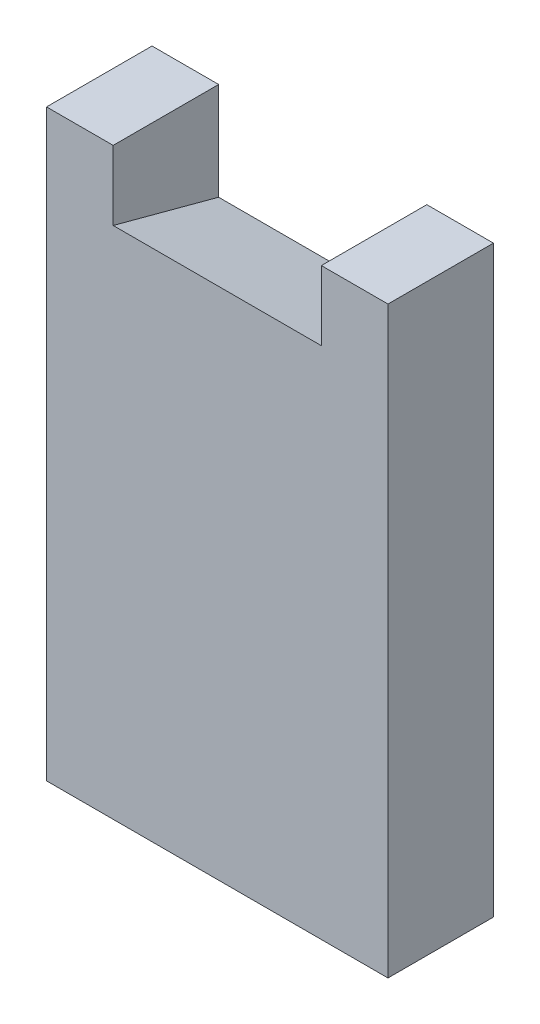
ISO-10303-21;
HEADER;
FILE_DESCRIPTION(('STEP AP214'),'2;1');
FILE_NAME('part.step','',(''),(''),'','','');
FILE_SCHEMA(('AUTOMOTIVE_DESIGN { 1 0 10303 214 1 1 1 1 }'));
ENDSEC;
DATA;
#1=APPLICATION_CONTEXT('core data for automotive mechanical design processes');
#2=APPLICATION_PROTOCOL_DEFINITION('international standard','automotive_design',2000,#1);
#3=PRODUCT_CONTEXT('',#1,'mechanical');
#4=PRODUCT('Part','Part','',(#3));
#5=PRODUCT_RELATED_PRODUCT_CATEGORY('part','',(#4));
#6=PRODUCT_DEFINITION_FORMATION('','',#4);
#7=PRODUCT_DEFINITION_CONTEXT('part definition',#1,'design');
#8=PRODUCT_DEFINITION('design','',#6,#7);
#9=PRODUCT_DEFINITION_SHAPE('','',#8);
#10=(LENGTH_UNIT() NAMED_UNIT(*) SI_UNIT(.MILLI.,.METRE.));
#11=(NAMED_UNIT(*) PLANE_ANGLE_UNIT() SI_UNIT($,.RADIAN.));
#12=(NAMED_UNIT(*) SI_UNIT($,.STERADIAN.) SOLID_ANGLE_UNIT());
#13=UNCERTAINTY_MEASURE_WITH_UNIT(LENGTH_MEASURE(1.E-05),#10,'distance_accuracy_value','');
#14=(GEOMETRIC_REPRESENTATION_CONTEXT(3) GLOBAL_UNCERTAINTY_ASSIGNED_CONTEXT((#13)) GLOBAL_UNIT_ASSIGNED_CONTEXT((#10,
#11,#12)) REPRESENTATION_CONTEXT('',''));
#15=CARTESIAN_POINT('',(0.,0.,0.));
#16=DIRECTION('',(0.,0.,1.));
#17=DIRECTION('',(1.,0.,0.));
#18=AXIS2_PLACEMENT_3D('',#15,#16,#17);
#19=CARTESIAN_POINT('',(0.,0.,7.6));
#20=DIRECTION('',(0.,1.,0.));
#21=DIRECTION('',(-1.,0.,0.));
#22=AXIS2_PLACEMENT_3D('',#19,#20,#21);
#23=PLANE('',#22);
#24=DIRECTION('',(1.,0.,0.));
#25=VECTOR('',#24,1.);
#26=CARTESIAN_POINT('',(0.,0.,0.));
#27=LINE('',#26,#25);
#28=CARTESIAN_POINT('',(19.8,0.,0.));
#29=VERTEX_POINT('',#28);
#30=CARTESIAN_POINT('',(24.6,0.,0.));
#31=VERTEX_POINT('',#30);
#32=EDGE_CURVE('E117',#29,#31,#27,.T.);
#33=ORIENTED_EDGE('',*,*,#32,.F.);
#34=DIRECTION('',(0.,0.,-1.));
#35=VECTOR('',#34,1.);
#36=CARTESIAN_POINT('',(19.8,0.,7.6));
#37=LINE('',#36,#35);
#38=CARTESIAN_POINT('',(19.8,0.,7.6));
#39=VERTEX_POINT('',#38);
#40=EDGE_CURVE('E11',#39,#29,#37,.T.);
#41=ORIENTED_EDGE('',*,*,#40,.F.);
#42=DIRECTION('',(1.,0.,0.));
#43=VECTOR('',#42,1.);
#44=CARTESIAN_POINT('',(0.,0.,7.6));
#45=LINE('',#44,#43);
#46=CARTESIAN_POINT('',(24.6,0.,7.6));
#47=VERTEX_POINT('',#46);
#48=EDGE_CURVE('E127',#39,#47,#45,.T.);
#49=ORIENTED_EDGE('',*,*,#48,.T.);
#50=DIRECTION('',(0.,0.,-1.));
#51=VECTOR('',#50,1.);
#52=CARTESIAN_POINT('',(24.6,0.,7.6));
#53=LINE('',#52,#51);
#54=EDGE_CURVE('E58',#47,#31,#53,.T.);
#55=ORIENTED_EDGE('',*,*,#54,.T.);
#56=EDGE_LOOP('',(#33,#41,#49,#55));
#57=FACE_BOUND('',#56,.T.);
#58=ADVANCED_FACE('F39',(#57),#23,.T.);
#59=CARTESIAN_POINT('',(19.8,0.,7.6));
#60=DIRECTION('',(1.,0.,0.));
#61=DIRECTION('',(0.,0.,-1.));
#62=AXIS2_PLACEMENT_3D('',#59,#60,#61);
#63=PLANE('',#62);
#64=DIRECTION('',(0.,-1.,0.));
#65=VECTOR('',#64,1.);
#66=CARTESIAN_POINT('',(19.8,0.,0.));
#67=LINE('',#66,#65);
#68=CARTESIAN_POINT('',(19.8,-7.03641386247654,0.));
#69=VERTEX_POINT('',#68);
#70=EDGE_CURVE('E107',#29,#69,#67,.T.);
#71=ORIENTED_EDGE('',*,*,#70,.T.);
#72=DIRECTION('',(0.,-0.258819045102521,-0.965925826289068));
#73=VECTOR('',#72,1.);
#74=CARTESIAN_POINT('',(19.8,-5.,7.6));
#75=LINE('',#74,#73);
#76=CARTESIAN_POINT('',(19.8,-5.,7.6));
#77=VERTEX_POINT('',#76);
#78=EDGE_CURVE('E49',#77,#69,#75,.T.);
#79=ORIENTED_EDGE('',*,*,#78,.F.);
#80=DIRECTION('',(0.,-1.,0.));
#81=VECTOR('',#80,1.);
#82=CARTESIAN_POINT('',(19.8,0.,7.6));
#83=LINE('',#82,#81);
#84=EDGE_CURVE('E155',#39,#77,#83,.T.);
#85=ORIENTED_EDGE('',*,*,#84,.F.);
#86=ORIENTED_EDGE('',*,*,#40,.T.);
#87=EDGE_LOOP('',(#71,#79,#85,#86));
#88=FACE_BOUND('',#87,.T.);
#89=ADVANCED_FACE('F164',(#88),#63,.F.);
#90=CARTESIAN_POINT('',(0.,-5.,7.6));
#91=DIRECTION('',(0.,0.965925826289068,-0.258819045102521));
#92=DIRECTION('',(0.,0.258819045102521,0.965925826289068));
#93=AXIS2_PLACEMENT_3D('',#90,#91,#92);
#94=PLANE('',#93);
#95=DIRECTION('',(1.,0.,0.));
#96=VECTOR('',#95,1.);
#97=CARTESIAN_POINT('',(0.,-7.03641386247654,0.));
#98=LINE('',#97,#96);
#99=CARTESIAN_POINT('',(4.8,-7.03641386247654,0.));
#100=VERTEX_POINT('',#99);
#101=EDGE_CURVE('E104',#100,#69,#98,.T.);
#102=ORIENTED_EDGE('',*,*,#101,.F.);
#103=DIRECTION('',(0.,-0.258819045102521,-0.965925826289068));
#104=VECTOR('',#103,1.);
#105=CARTESIAN_POINT('',(4.8,-5.,7.6));
#106=LINE('',#105,#104);
#107=CARTESIAN_POINT('',(4.8,-5.,7.6));
#108=VERTEX_POINT('',#107);
#109=EDGE_CURVE('E43',#108,#100,#106,.T.);
#110=ORIENTED_EDGE('',*,*,#109,.F.);
#111=DIRECTION('',(1.,0.,0.));
#112=VECTOR('',#111,1.);
#113=CARTESIAN_POINT('',(0.,-5.,7.6));
#114=LINE('',#113,#112);
#115=EDGE_CURVE('E151',#108,#77,#114,.T.);
#116=ORIENTED_EDGE('',*,*,#115,.T.);
#117=ORIENTED_EDGE('',*,*,#78,.T.);
#118=EDGE_LOOP('',(#102,#110,#116,#117));
#119=FACE_BOUND('',#118,.T.);
#120=ADVANCED_FACE('F41',(#119),#94,.T.);
#121=CARTESIAN_POINT('',(4.8,0.,7.6));
#122=DIRECTION('',(1.,0.,0.));
#123=DIRECTION('',(0.,1.,0.));
#124=AXIS2_PLACEMENT_3D('',#121,#122,#123);
#125=PLANE('',#124);
#126=DIRECTION('',(0.,-1.,0.));
#127=VECTOR('',#126,1.);
#128=CARTESIAN_POINT('',(4.8,0.,0.));
#129=LINE('',#128,#127);
#130=CARTESIAN_POINT('',(4.8,0.,0.));
#131=VERTEX_POINT('',#130);
#132=EDGE_CURVE('E96',#131,#100,#129,.T.);
#133=ORIENTED_EDGE('',*,*,#132,.F.);
#134=DIRECTION('',(0.,0.,-1.));
#135=VECTOR('',#134,1.);
#136=CARTESIAN_POINT('',(4.8,0.,7.6));
#137=LINE('',#136,#135);
#138=CARTESIAN_POINT('',(4.8,0.,7.6));
#139=VERTEX_POINT('',#138);
#140=EDGE_CURVE('E102',#139,#131,#137,.T.);
#141=ORIENTED_EDGE('',*,*,#140,.F.);
#142=DIRECTION('',(0.,-1.,0.));
#143=VECTOR('',#142,1.);
#144=CARTESIAN_POINT('',(4.8,0.,7.6));
#145=LINE('',#144,#143);
#146=EDGE_CURVE('E100',#139,#108,#145,.T.);
#147=ORIENTED_EDGE('',*,*,#146,.T.);
#148=ORIENTED_EDGE('',*,*,#109,.T.);
#149=EDGE_LOOP('',(#133,#141,#147,#148));
#150=FACE_BOUND('',#149,.T.);
#151=ADVANCED_FACE('F93',(#150),#125,.T.);
#152=CARTESIAN_POINT('',(0.,0.,0.));
#153=VERTEX_POINT('',#152);
#154=EDGE_CURVE('E113',#153,#131,#27,.T.);
#155=ORIENTED_EDGE('',*,*,#154,.F.);
#156=DIRECTION('',(0.,0.,-1.));
#157=VECTOR('',#156,1.);
#158=CARTESIAN_POINT('',(0.,0.,7.6));
#159=LINE('',#158,#157);
#160=CARTESIAN_POINT('',(0.,0.,7.6));
#161=VERTEX_POINT('',#160);
#162=EDGE_CURVE('E135',#161,#153,#159,.T.);
#163=ORIENTED_EDGE('',*,*,#162,.F.);
#164=EDGE_CURVE('E143',#161,#139,#45,.T.);
#165=ORIENTED_EDGE('',*,*,#164,.T.);
#166=ORIENTED_EDGE('',*,*,#140,.T.);
#167=EDGE_LOOP('',(#155,#163,#165,#166));
#168=FACE_BOUND('',#167,.T.);
#169=ADVANCED_FACE('F139',(#168),#23,.T.);
#170=CARTESIAN_POINT('',(0.,0.,7.6));
#171=DIRECTION('',(1.,0.,0.));
#172=DIRECTION('',(0.,1.,0.));
#173=AXIS2_PLACEMENT_3D('',#170,#171,#172);
#174=PLANE('',#173);
#175=DIRECTION('',(0.,-1.,0.));
#176=VECTOR('',#175,1.);
#177=CARTESIAN_POINT('',(0.,0.,0.));
#178=LINE('',#177,#176);
#179=CARTESIAN_POINT('',(0.,-42.055,0.));
#180=VERTEX_POINT('',#179);
#181=EDGE_CURVE('E115',#153,#180,#178,.T.);
#182=ORIENTED_EDGE('',*,*,#181,.T.);
#183=DIRECTION('',(0.,0.,-1.));
#184=VECTOR('',#183,1.);
#185=CARTESIAN_POINT('',(0.,-42.055,7.6));
#186=LINE('',#185,#184);
#187=CARTESIAN_POINT('',(0.,-42.055,7.6));
#188=VERTEX_POINT('',#187);
#189=EDGE_CURVE('E132',#188,#180,#186,.T.);
#190=ORIENTED_EDGE('',*,*,#189,.F.);
#191=DIRECTION('',(0.,-1.,0.));
#192=VECTOR('',#191,1.);
#193=CARTESIAN_POINT('',(0.,0.,7.6));
#194=LINE('',#193,#192);
#195=EDGE_CURVE('E153',#161,#188,#194,.T.);
#196=ORIENTED_EDGE('',*,*,#195,.F.);
#197=ORIENTED_EDGE('',*,*,#162,.T.);
#198=EDGE_LOOP('',(#182,#190,#196,#197));
#199=FACE_BOUND('',#198,.T.);
#200=ADVANCED_FACE('F178',(#199),#174,.F.);
#201=CARTESIAN_POINT('',(0.,-42.055,7.6));
#202=DIRECTION('',(0.,1.,0.));
#203=DIRECTION('',(-1.,0.,0.));
#204=AXIS2_PLACEMENT_3D('',#201,#202,#203);
#205=PLANE('',#204);
#206=DIRECTION('',(1.,0.,0.));
#207=VECTOR('',#206,1.);
#208=CARTESIAN_POINT('',(0.,-42.055,0.));
#209=LINE('',#208,#207);
#210=CARTESIAN_POINT('',(24.6,-42.055,0.));
#211=VERTEX_POINT('',#210);
#212=EDGE_CURVE('E121',#180,#211,#209,.T.);
#213=ORIENTED_EDGE('',*,*,#212,.T.);
#214=DIRECTION('',(0.,0.,-1.));
#215=VECTOR('',#214,1.);
#216=CARTESIAN_POINT('',(24.6,-42.055,7.6));
#217=LINE('',#216,#215);
#218=CARTESIAN_POINT('',(24.6,-42.055,7.6));
#219=VERTEX_POINT('',#218);
#220=EDGE_CURVE('E129',#219,#211,#217,.T.);
#221=ORIENTED_EDGE('',*,*,#220,.F.);
#222=DIRECTION('',(1.,0.,0.));
#223=VECTOR('',#222,1.);
#224=CARTESIAN_POINT('',(0.,-42.055,7.6));
#225=LINE('',#224,#223);
#226=EDGE_CURVE('E160',#188,#219,#225,.T.);
#227=ORIENTED_EDGE('',*,*,#226,.F.);
#228=ORIENTED_EDGE('',*,*,#189,.T.);
#229=EDGE_LOOP('',(#213,#221,#227,#228));
#230=FACE_BOUND('',#229,.T.);
#231=ADVANCED_FACE('F175',(#230),#205,.F.);
#232=CARTESIAN_POINT('',(24.6,0.,7.6));
#233=DIRECTION('',(1.,0.,0.));
#234=DIRECTION('',(0.,1.,0.));
#235=AXIS2_PLACEMENT_3D('',#232,#233,#234);
#236=PLANE('',#235);
#237=DIRECTION('',(0.,-1.,0.));
#238=VECTOR('',#237,1.);
#239=CARTESIAN_POINT('',(24.6,0.,0.));
#240=LINE('',#239,#238);
#241=EDGE_CURVE('E124',#31,#211,#240,.T.);
#242=ORIENTED_EDGE('',*,*,#241,.F.);
#243=ORIENTED_EDGE('',*,*,#54,.F.);
#244=DIRECTION('',(0.,-1.,0.));
#245=VECTOR('',#244,1.);
#246=CARTESIAN_POINT('',(24.6,0.,7.6));
#247=LINE('',#246,#245);
#248=EDGE_CURVE('E130',#47,#219,#247,.T.);
#249=ORIENTED_EDGE('',*,*,#248,.T.);
#250=ORIENTED_EDGE('',*,*,#220,.T.);
#251=EDGE_LOOP('',(#242,#243,#249,#250));
#252=FACE_BOUND('',#251,.T.);
#253=ADVANCED_FACE('F172',(#252),#236,.T.);
#254=CARTESIAN_POINT('',(0.,0.,7.6));
#255=DIRECTION('',(0.,0.,1.));
#256=DIRECTION('',(1.,0.,0.));
#257=AXIS2_PLACEMENT_3D('',#254,#255,#256);
#258=PLANE('',#257);
#259=ORIENTED_EDGE('',*,*,#48,.F.);
#260=ORIENTED_EDGE('',*,*,#84,.T.);
#261=ORIENTED_EDGE('',*,*,#115,.F.);
#262=ORIENTED_EDGE('',*,*,#146,.F.);
#263=ORIENTED_EDGE('',*,*,#164,.F.);
#264=ORIENTED_EDGE('',*,*,#195,.T.);
#265=ORIENTED_EDGE('',*,*,#226,.T.);
#266=ORIENTED_EDGE('',*,*,#248,.F.);
#267=EDGE_LOOP('',(#259,#260,#261,#262,#263,#264,#265,#266));
#268=FACE_BOUND('',#267,.T.);
#269=ADVANCED_FACE('F148',(#268),#258,.T.);
#270=CARTESIAN_POINT('',(0.,0.,0.));
#271=DIRECTION('',(0.,0.,1.));
#272=DIRECTION('',(1.,0.,0.));
#273=AXIS2_PLACEMENT_3D('',#270,#271,#272);
#274=PLANE('',#273);
#275=ORIENTED_EDGE('',*,*,#32,.T.);
#276=ORIENTED_EDGE('',*,*,#241,.T.);
#277=ORIENTED_EDGE('',*,*,#212,.F.);
#278=ORIENTED_EDGE('',*,*,#181,.F.);
#279=ORIENTED_EDGE('',*,*,#154,.T.);
#280=ORIENTED_EDGE('',*,*,#132,.T.);
#281=ORIENTED_EDGE('',*,*,#101,.T.);
#282=ORIENTED_EDGE('',*,*,#70,.F.);
#283=EDGE_LOOP('',(#275,#276,#277,#278,#279,#280,#281,#282));
#284=FACE_BOUND('',#283,.T.);
#285=ADVANCED_FACE('F110',(#284),#274,.F.);
#286=CLOSED_SHELL('',(#58,#89,#120,#151,#169,#200,#231,#253,#269,#285));
#287=MANIFOLD_SOLID_BREP('B2',#286);
#288=ADVANCED_BREP_SHAPE_REPRESENTATION('',(#18,#287),#14);
#289=SHAPE_DEFINITION_REPRESENTATION(#9,#288);
ENDSEC;
END-ISO-10303-21;
